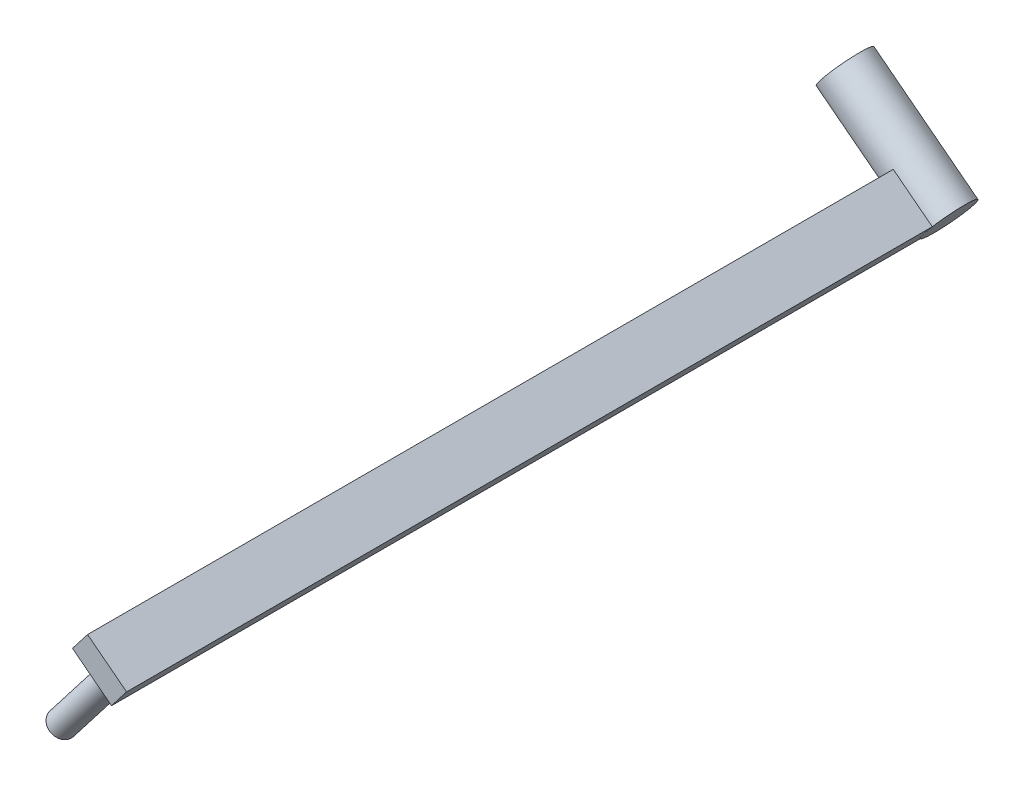
ISO-10303-21;
HEADER;
FILE_DESCRIPTION(('STEP AP214'),'2;1');
FILE_NAME('part.step','',(''),(''),'','','');
FILE_SCHEMA(('AUTOMOTIVE_DESIGN { 1 0 10303 214 1 1 1 1 }'));
ENDSEC;
DATA;
#1=APPLICATION_CONTEXT('core data for automotive mechanical design processes');
#2=APPLICATION_PROTOCOL_DEFINITION('international standard','automotive_design',2000,#1);
#3=PRODUCT_CONTEXT('',#1,'mechanical');
#4=PRODUCT('Part','Part','',(#3));
#5=PRODUCT_RELATED_PRODUCT_CATEGORY('part','',(#4));
#6=PRODUCT_DEFINITION_FORMATION('','',#4);
#7=PRODUCT_DEFINITION_CONTEXT('part definition',#1,'design');
#8=PRODUCT_DEFINITION('design','',#6,#7);
#9=PRODUCT_DEFINITION_SHAPE('','',#8);
#10=(LENGTH_UNIT() NAMED_UNIT(*) SI_UNIT(.MILLI.,.METRE.));
#11=(NAMED_UNIT(*) PLANE_ANGLE_UNIT() SI_UNIT($,.RADIAN.));
#12=(NAMED_UNIT(*) SI_UNIT($,.STERADIAN.) SOLID_ANGLE_UNIT());
#13=UNCERTAINTY_MEASURE_WITH_UNIT(LENGTH_MEASURE(1.E-05),#10,'distance_accuracy_value','');
#14=(GEOMETRIC_REPRESENTATION_CONTEXT(3) GLOBAL_UNCERTAINTY_ASSIGNED_CONTEXT((#13)) GLOBAL_UNIT_ASSIGNED_CONTEXT((#10,
#11,#12)) REPRESENTATION_CONTEXT('',''));
#15=CARTESIAN_POINT('',(0.,0.,0.));
#16=DIRECTION('',(0.,0.,1.));
#17=DIRECTION('',(1.,0.,0.));
#18=AXIS2_PLACEMENT_3D('',#15,#16,#17);
#19=CARTESIAN_POINT('',(-180.64816500639,168.184125113509,-1.22395092024198E-13));
#20=DIRECTION('',(-0.611527040185828,-0.791223532967492,0.));
#21=DIRECTION('',(0.791223532967493,-0.611527040185828,0.));
#22=AXIS2_PLACEMENT_3D('',#19,#20,#21);
#23=PLANE('',#22);
#24=DIRECTION('',(0.,0.,1.));
#25=VECTOR('',#24,1.);
#26=CARTESIAN_POINT('',(-183.021835605293,170.018706234067,-1.23368285722228E-13));
#27=LINE('',#26,#25);
#28=CARTESIAN_POINT('',(-183.021835605293,170.018706234067,-196.122895608607));
#29=VERTEX_POINT('',#28);
#30=CARTESIAN_POINT('',(-183.021835605293,170.018706234067,-147.122895608606));
#31=VERTEX_POINT('',#30);
#32=EDGE_CURVE('E120',#29,#31,#27,.T.);
#33=ORIENTED_EDGE('',*,*,#32,.T.);
#34=DIRECTION('',(-0.791223532967492,0.611527040185828,0.));
#35=VECTOR('',#34,1.);
#36=CARTESIAN_POINT('',(-180.64816500639,168.184125113509,-147.122895608606));
#37=LINE('',#36,#35);
#38=CARTESIAN_POINT('',(-180.64816500639,168.184125113509,-147.122895608606));
#39=VERTEX_POINT('',#38);
#40=EDGE_CURVE('E13',#39,#31,#37,.T.);
#41=ORIENTED_EDGE('',*,*,#40,.F.);
#42=DIRECTION('',(0.,0.,1.));
#43=VECTOR('',#42,1.);
#44=CARTESIAN_POINT('',(-180.64816500639,168.184125113509,-1.22395092024198E-13));
#45=LINE('',#44,#43);
#46=CARTESIAN_POINT('',(-180.64816500639,168.184125113509,-196.122895608607));
#47=VERTEX_POINT('',#46);
#48=EDGE_CURVE('E105',#47,#39,#45,.T.);
#49=ORIENTED_EDGE('',*,*,#48,.F.);
#50=DIRECTION('',(-0.791223532967492,0.611527040185828,0.));
#51=VECTOR('',#50,1.);
#52=CARTESIAN_POINT('',(-180.64816500639,168.184125113509,-196.122895608607));
#53=LINE('',#52,#51);
#54=EDGE_CURVE('E116',#47,#29,#53,.T.);
#55=ORIENTED_EDGE('',*,*,#54,.T.);
#56=EDGE_LOOP('',(#33,#41,#49,#55));
#57=FACE_BOUND('',#56,.T.);
#58=ADVANCED_FACE('F58',(#57),#23,.F.);
#59=CARTESIAN_POINT('',(-194.468676114589,150.302473268445,-147.122895608606));
#60=DIRECTION('',(0.,0.,-1.));
#61=DIRECTION('',(-1.,0.,0.));
#62=AXIS2_PLACEMENT_3D('',#59,#60,#61);
#63=PLANE('',#62);
#64=DIRECTION('',(-0.611527040185828,-0.791223532967493,0.));
#65=VECTOR('',#64,1.);
#66=CARTESIAN_POINT('',(-196.842346713492,152.137054389003,-147.122895608606));
#67=LINE('',#66,#65);
#68=CARTESIAN_POINT('',(-183.939126165572,168.831870934616,-147.122895608606));
#69=VERTEX_POINT('',#68);
#70=EDGE_CURVE('E110',#31,#69,#67,.T.);
#71=ORIENTED_EDGE('',*,*,#70,.T.);
#72=DIRECTION('',(-0.791223532967492,0.611527040185828,0.));
#73=VECTOR('',#72,1.);
#74=CARTESIAN_POINT('',(-181.565455566669,166.997289814058,-147.122895608606));
#75=LINE('',#74,#73);
#76=CARTESIAN_POINT('',(-181.565455566669,166.997289814058,-147.122895608606));
#77=VERTEX_POINT('',#76);
#78=EDGE_CURVE('E66',#77,#69,#75,.T.);
#79=ORIENTED_EDGE('',*,*,#78,.F.);
#80=DIRECTION('',(-0.611527040185828,-0.791223532967493,0.));
#81=VECTOR('',#80,1.);
#82=CARTESIAN_POINT('',(-194.468676114589,150.302473268445,-147.122895608606));
#83=LINE('',#82,#81);
#84=EDGE_CURVE('E100',#39,#77,#83,.T.);
#85=ORIENTED_EDGE('',*,*,#84,.F.);
#86=ORIENTED_EDGE('',*,*,#40,.T.);
#87=EDGE_LOOP('',(#71,#79,#85,#86));
#88=FACE_BOUND('',#87,.T.);
#89=ADVANCED_FACE('F109',(#88),#63,.F.);
#90=CARTESIAN_POINT('',(-181.565455566669,166.997289814058,-1.30223586740734E-13));
#91=DIRECTION('',(-0.611527040185828,-0.791223532967492,0.));
#92=DIRECTION('',(0.791223532967493,-0.611527040185828,0.));
#93=AXIS2_PLACEMENT_3D('',#90,#91,#92);
#94=PLANE('',#93);
#95=CARTESIAN_POINT('',(-182.390496862954,167.634954191982,-147.977498822314));
#96=DIRECTION('',(-0.611527040185828,-0.791223532967493,0.));
#97=DIRECTION('',(0.791223532967493,-0.611527040185828,0.));
#98=AXIS2_PLACEMENT_3D('',#95,#96,#97);
#99=CIRCLE('',#98,0.74999999998796);
#100=CARTESIAN_POINT('',(-181.797079213238,167.17630891185,-147.977498822314));
#101=VERTEX_POINT('',#100);
#102=EDGE_CURVE('E196',#101,#101,#99,.T.);
#103=ORIENTED_EDGE('',*,*,#102,.F.);
#104=EDGE_LOOP('',(#103));
#105=FACE_BOUND('',#104,.T.);
#106=DIRECTION('',(0.,0.,1.));
#107=VECTOR('',#106,1.);
#108=CARTESIAN_POINT('',(-183.939126165572,168.831870934616,-1.31196780438764E-13));
#109=LINE('',#108,#107);
#110=CARTESIAN_POINT('',(-183.939126165572,168.831870934616,-196.29704261835));
#111=VERTEX_POINT('',#110);
#112=EDGE_CURVE('E125',#111,#69,#109,.T.);
#113=ORIENTED_EDGE('',*,*,#112,.F.);
#114=DIRECTION('',(-0.791223532967492,0.611527040185828,0.));
#115=VECTOR('',#114,1.);
#116=CARTESIAN_POINT('',(-181.565455566669,166.997289814058,-196.29704261835));
#117=LINE('',#116,#115);
#118=CARTESIAN_POINT('',(-181.565455566669,166.997289814058,-196.29704261835));
#119=VERTEX_POINT('',#118);
#120=EDGE_CURVE('E90',#119,#111,#117,.T.);
#121=ORIENTED_EDGE('',*,*,#120,.F.);
#122=DIRECTION('',(0.,0.,1.));
#123=VECTOR('',#122,1.);
#124=CARTESIAN_POINT('',(-181.565455566669,166.997289814058,-1.30223586740734E-13));
#125=LINE('',#124,#123);
#126=EDGE_CURVE('E103',#119,#77,#125,.T.);
#127=ORIENTED_EDGE('',*,*,#126,.T.);
#128=ORIENTED_EDGE('',*,*,#78,.T.);
#129=EDGE_LOOP('',(#113,#121,#127,#128));
#130=FACE_BOUND('',#129,.T.);
#131=ADVANCED_FACE('F114',(#105,#130),#94,.T.);
#132=CARTESIAN_POINT('',(-181.014305085947,167.710395207437,-197.512913026703));
#133=DIRECTION('',(-0.791223532967492,0.611527040185828,0.));
#134=DIRECTION('',(-0.611527040185828,-0.791223532967493,0.));
#135=AXIS2_PLACEMENT_3D('',#132,#133,#134);
#136=CYLINDRICAL_SURFACE('',#135,1.51348174894076);
#137=CARTESIAN_POINT('',(-183.387975684849,169.544976327995,-197.512913026703));
#138=DIRECTION('',(0.791223532967492,-0.611527040185828,0.));
#139=DIRECTION('',(0.611527040185828,0.791223532967493,0.));
#140=AXIS2_PLACEMENT_3D('',#137,#138,#139);
#141=CIRCLE('',#140,1.51348174894076);
#142=EDGE_CURVE('E93',#111,#29,#141,.F.);
#143=ORIENTED_EDGE('',*,*,#142,.T.);
#144=ORIENTED_EDGE('',*,*,#54,.F.);
#145=CARTESIAN_POINT('',(-181.014305085947,167.710395207437,-197.512913026703));
#146=DIRECTION('',(0.791223532967492,-0.611527040185828,0.));
#147=DIRECTION('',(0.611527040185828,0.791223532967493,0.));
#148=AXIS2_PLACEMENT_3D('',#145,#146,#147);
#149=CIRCLE('',#148,1.51348174894076);
#150=EDGE_CURVE('E74',#119,#47,#149,.F.);
#151=ORIENTED_EDGE('',*,*,#150,.F.);
#152=ORIENTED_EDGE('',*,*,#120,.T.);
#153=EDGE_LOOP('',(#143,#144,#151,#152));
#154=FACE_BOUND('',#153,.T.);
#155=ADVANCED_FACE('F143',(#154),#136,.F.);
#156=CARTESIAN_POINT('',(-194.468676114589,150.302473268445,-1.30223586740734E-13));
#157=DIRECTION('',(0.791223532967492,-0.611527040185828,0.));
#158=DIRECTION('',(0.611527040185828,0.791223532967493,0.));
#159=AXIS2_PLACEMENT_3D('',#156,#157,#158);
#160=PLANE('',#159);
#161=ORIENTED_EDGE('',*,*,#48,.T.);
#162=ORIENTED_EDGE('',*,*,#84,.T.);
#163=ORIENTED_EDGE('',*,*,#126,.F.);
#164=ORIENTED_EDGE('',*,*,#150,.T.);
#165=EDGE_LOOP('',(#161,#162,#163,#164));
#166=FACE_BOUND('',#165,.T.);
#167=ADVANCED_FACE('F101',(#166),#160,.T.);
#168=CARTESIAN_POINT('',(-196.842346713492,152.137054389003,-1.31196780438764E-13));
#169=DIRECTION('',(0.791223532967492,-0.611527040185828,0.));
#170=DIRECTION('',(0.611527040185828,0.791223532967493,0.));
#171=AXIS2_PLACEMENT_3D('',#168,#169,#170);
#172=PLANE('',#171);
#173=ORIENTED_EDGE('',*,*,#32,.F.);
#174=ORIENTED_EDGE('',*,*,#142,.F.);
#175=ORIENTED_EDGE('',*,*,#112,.T.);
#176=ORIENTED_EDGE('',*,*,#70,.F.);
#177=EDGE_LOOP('',(#173,#174,#175,#176));
#178=FACE_BOUND('',#177,.T.);
#179=ADVANCED_FACE('F132',(#178),#172,.F.);
#180=CARTESIAN_POINT('',(-185.448132063884,163.678836527145,-147.977498822314));
#181=DIRECTION('',(0.611527040185828,0.791223532967493,0.));
#182=DIRECTION('',(-0.791223532967493,0.611527040185828,0.));
#183=AXIS2_PLACEMENT_3D('',#180,#181,#182);
#184=CYLINDRICAL_SURFACE('',#183,0.74999999998796);
#185=CARTESIAN_POINT('',(-185.448132063884,163.678836527145,-147.977498822314));
#186=DIRECTION('',(-0.611527040185828,-0.791223532967493,0.));
#187=DIRECTION('',(0.791223532967493,-0.611527040185828,0.));
#188=AXIS2_PLACEMENT_3D('',#185,#186,#187);
#189=CIRCLE('',#188,0.74999999998796);
#190=CARTESIAN_POINT('',(-184.854714414167,163.220191247013,-147.977498822314));
#191=VERTEX_POINT('',#190);
#192=EDGE_CURVE('E123',#191,#191,#189,.T.);
#193=ORIENTED_EDGE('',*,*,#192,.F.);
#194=EDGE_LOOP('',(#193));
#195=FACE_BOUND('',#194,.T.);
#196=ORIENTED_EDGE('',*,*,#102,.T.);
#197=EDGE_LOOP('',(#196));
#198=FACE_BOUND('',#197,.T.);
#199=ADVANCED_FACE('F134',(#195,#198),#184,.T.);
#200=CARTESIAN_POINT('',(-185.448132063884,163.678836527145,-147.977498822314));
#201=DIRECTION('',(-0.611527040185828,-0.791223532967493,0.));
#202=DIRECTION('',(0.791223532967493,-0.611527040185828,0.));
#203=AXIS2_PLACEMENT_3D('',#200,#201,#202);
#204=PLANE('',#203);
#205=ORIENTED_EDGE('',*,*,#192,.T.);
#206=EDGE_LOOP('',(#205));
#207=FACE_BOUND('',#206,.T.);
#208=ADVANCED_FACE('F140',(#207),#204,.T.);
#209=CLOSED_SHELL('',(#58,#89,#131,#155,#167,#179,#199,#208));
#210=MANIFOLD_SOLID_BREP('B2',#209);
#211=CARTESIAN_POINT('',(-187.344093349687,172.602611528924,-197.512913026703));
#212=DIRECTION('',(0.791223532967493,-0.611527040185828,0.));
#213=DIRECTION('',(0.611527040185828,0.791223532967493,0.));
#214=AXIS2_PLACEMENT_3D('',#211,#212,#213);
#215=CYLINDRICAL_SURFACE('',#214,1.5);
#216=CARTESIAN_POINT('',(-187.344093349687,172.602611528924,-197.512913026703));
#217=DIRECTION('',(0.791223532967492,-0.611527040185828,0.));
#218=DIRECTION('',(0.611527040185828,0.791223532967493,0.));
#219=AXIS2_PLACEMENT_3D('',#216,#217,#218);
#220=CIRCLE('',#219,1.5);
#221=CARTESIAN_POINT('',(-186.426802789408,173.789446828375,-197.512913026703));
#222=VERTEX_POINT('',#221);
#223=EDGE_CURVE('E57',#222,#222,#220,.T.);
#224=CARTESIAN_POINT('',(-181.014305085947,167.710395207437,-197.512913026703));
#225=DIRECTION('',(0.791223532967492,-0.611527040185828,0.));
#226=DIRECTION('',(0.611527040185828,0.791223532967493,0.));
#227=AXIS2_PLACEMENT_3D('',#224,#225,#226);
#228=CIRCLE('',#227,1.5);
#229=CARTESIAN_POINT('',(-180.097014525668,168.897230506889,-197.512913026703));
#230=VERTEX_POINT('',#229);
#231=EDGE_CURVE('E224',#230,#230,#228,.T.);
#232=CARTESIAN_POINT('',(-186.426802789408,173.789446828375,-197.512913026703));
#233=CARTESIAN_POINT('',(-186.360867494994,173.738486241693,-197.512913026703));
#234=CARTESIAN_POINT('',(-186.29493220058,173.687525655011,-197.512913026703));
#235=CARTESIAN_POINT('',(-186.163061611752,173.585604481647,-197.512913026703));
#236=CARTESIAN_POINT('',(-186.097126317338,173.534643894964,-197.512913026703));
#237=CARTESIAN_POINT('',(-185.96525572851,173.4327227216,-197.512913026703));
#238=CARTESIAN_POINT('',(-185.899320434096,173.381762134918,-197.512913026703));
#239=CARTESIAN_POINT('',(-185.767449845269,173.279840961554,-197.512913026703));
#240=CARTESIAN_POINT('',(-185.701514550855,173.228880374871,-197.512913026703));
#241=CARTESIAN_POINT('',(-185.569643962027,173.126959201507,-197.512913026703));
#242=CARTESIAN_POINT('',(-185.503708667613,173.075998614825,-197.512913026703));
#243=CARTESIAN_POINT('',(-185.371838078785,172.974077441461,-197.512913026703));
#244=CARTESIAN_POINT('',(-185.305902784371,172.923116854779,-197.512913026703));
#245=CARTESIAN_POINT('',(-185.174032195543,172.821195681414,-197.512913026703));
#246=CARTESIAN_POINT('',(-185.108096901129,172.770235094732,-197.512913026703));
#247=CARTESIAN_POINT('',(-184.976226312301,172.668313921368,-197.512913026703));
#248=CARTESIAN_POINT('',(-184.910291017887,172.617353334686,-197.512913026703));
#249=CARTESIAN_POINT('',(-184.778420429059,172.515432161321,-197.512913026703));
#250=CARTESIAN_POINT('',(-184.712485134645,172.464471574639,-197.512913026703));
#251=CARTESIAN_POINT('',(-184.580614545817,172.362550401275,-197.512913026703));
#252=CARTESIAN_POINT('',(-184.514679251403,172.311589814593,-197.512913026703));
#253=CARTESIAN_POINT('',(-184.382808662575,172.209668641228,-197.512913026703));
#254=CARTESIAN_POINT('',(-184.316873368161,172.158708054546,-197.512913026703));
#255=CARTESIAN_POINT('',(-184.185002779334,172.056786881182,-197.512913026703));
#256=CARTESIAN_POINT('',(-184.11906748492,172.0058262945,-197.512913026703));
#257=CARTESIAN_POINT('',(-183.987196896092,171.903905121136,-197.512913026703));
#258=CARTESIAN_POINT('',(-183.921261601678,171.852944534453,-197.512913026703));
#259=CARTESIAN_POINT('',(-183.78939101285,171.751023361089,-197.512913026703));
#260=CARTESIAN_POINT('',(-183.723455718436,171.700062774407,-197.512913026703));
#261=CARTESIAN_POINT('',(-183.591585129608,171.598141601043,-197.512913026703));
#262=CARTESIAN_POINT('',(-183.525649835194,171.54718101436,-197.512913026703));
#263=CARTESIAN_POINT('',(-183.393779246366,171.445259840996,-197.512913026703));
#264=CARTESIAN_POINT('',(-183.327843951952,171.394299254314,-197.512913026703));
#265=CARTESIAN_POINT('',(-183.195973363124,171.29237808095,-197.512913026703));
#266=CARTESIAN_POINT('',(-183.13003806871,171.241417494268,-197.512913026703));
#267=CARTESIAN_POINT('',(-182.998167479882,171.139496320903,-197.512913026703));
#268=CARTESIAN_POINT('',(-182.932232185468,171.088535734221,-197.512913026703));
#269=CARTESIAN_POINT('',(-182.80036159664,170.986614560857,-197.512913026703));
#270=CARTESIAN_POINT('',(-182.734426302226,170.935653974175,-197.512913026703));
#271=CARTESIAN_POINT('',(-182.602555713399,170.83373280081,-197.512913026703));
#272=CARTESIAN_POINT('',(-182.536620418985,170.782772214128,-197.512913026703));
#273=CARTESIAN_POINT('',(-182.404749830157,170.680851040764,-197.512913026703));
#274=CARTESIAN_POINT('',(-182.338814535743,170.629890454082,-197.512913026703));
#275=CARTESIAN_POINT('',(-182.206943946915,170.527969280717,-197.512913026703));
#276=CARTESIAN_POINT('',(-182.141008652501,170.477008694035,-197.512913026703));
#277=CARTESIAN_POINT('',(-182.009138063673,170.375087520671,-197.512913026703));
#278=CARTESIAN_POINT('',(-181.943202769259,170.324126933989,-197.512913026703));
#279=CARTESIAN_POINT('',(-181.811332180431,170.222205760625,-197.512913026703));
#280=CARTESIAN_POINT('',(-181.745396886017,170.171245173942,-197.512913026703));
#281=CARTESIAN_POINT('',(-181.613526297189,170.069324000578,-197.512913026703));
#282=CARTESIAN_POINT('',(-181.547591002775,170.018363413896,-197.512913026703));
#283=CARTESIAN_POINT('',(-181.415720413947,169.916442240532,-197.512913026703));
#284=CARTESIAN_POINT('',(-181.349785119533,169.865481653849,-197.512913026703));
#285=CARTESIAN_POINT('',(-181.217914530705,169.763560480485,-197.512913026703));
#286=CARTESIAN_POINT('',(-181.151979236292,169.712599893803,-197.512913026703));
#287=CARTESIAN_POINT('',(-181.020108647464,169.610678720439,-197.512913026703));
#288=CARTESIAN_POINT('',(-180.95417335305,169.559718133757,-197.512913026703));
#289=CARTESIAN_POINT('',(-180.822302764222,169.457796960392,-197.512913026703));
#290=CARTESIAN_POINT('',(-180.756367469808,169.40683637371,-197.512913026703));
#291=CARTESIAN_POINT('',(-180.62449688098,169.304915200346,-197.512913026703));
#292=CARTESIAN_POINT('',(-180.558561586566,169.253954613664,-197.512913026703));
#293=CARTESIAN_POINT('',(-180.426690997738,169.152033440299,-197.512913026703));
#294=CARTESIAN_POINT('',(-180.360755703324,169.101072853617,-197.512913026703));
#295=CARTESIAN_POINT('',(-180.228885114496,168.999151680253,-197.512913026703));
#296=CARTESIAN_POINT('',(-180.162949820082,168.948191093571,-197.512913026703));
#297=CARTESIAN_POINT('',(-180.097014525668,168.897230506889,-197.512913026703));
#298=B_SPLINE_CURVE_WITH_KNOTS('',3,(#232,#233,#234,#235,#236,#237,#238,#239,#240,#241,#242,
#243,#244,#245,#246,#247,#248,#249,#250,#251,#252,#253,#254,#255,#256,#257,#258,#259,#260,#261,
#262,#263,#264,#265,#266,#267,#268,#269,#270,#271,#272,#273,#274,#275,#276,#277,#278,#279,#280,
#281,#282,#283,#284,#285,#286,#287,#288,#289,#290,#291,#292,#293,#294,#295,#296,#297),
.UNSPECIFIED.,.F.,.F.,(4,2,2,2,2,2,2,2,2,2,2,2,2,2,2,2,2,2,2,2,2,2,2,2,2,2,2,2,2,2,2,2,4),(0.,
0.249999999999997,0.499999999999994,0.750000000000013,0.999999999999992,1.24999999999999,
1.50000000000001,1.75000000000001,1.99999999999998,2.25,2.5,2.75,3.,3.25,3.49999999999999,
3.74999999999999,3.99999999999999,4.24999999999999,4.50000000000001,4.75,4.99999999999998,5.25,
5.5,5.75,6.,6.24999999999999,6.49999999999999,6.74999999999999,6.99999999999999,
7.24999999999999,7.50000000000001,7.75,7.99999999999998),.UNSPECIFIED.);
#299=EDGE_CURVE('BSEAM218',#222,#230,#298,.T.);
#300=ORIENTED_EDGE('',*,*,#223,.T.);
#301=ORIENTED_EDGE('',*,*,#231,.F.);
#302=ORIENTED_EDGE('',*,*,#299,.T.);
#303=ORIENTED_EDGE('',*,*,#299,.F.);
#304=EDGE_LOOP('',(#300,#302,#301,#303));
#305=FACE_BOUND('',#304,.T.);
#306=ADVANCED_FACE('F218',(#305),#215,.T.);
#307=CARTESIAN_POINT('',(-200.798464378329,155.194689589932,-1.32818769935481E-13));
#308=DIRECTION('',(0.791223532967492,-0.611527040185828,0.));
#309=DIRECTION('',(0.611527040185828,0.791223532967493,0.));
#310=AXIS2_PLACEMENT_3D('',#307,#308,#309);
#311=PLANE('',#310);
#312=ORIENTED_EDGE('',*,*,#223,.F.);
#313=EDGE_LOOP('',(#312));
#314=FACE_BOUND('',#313,.T.);
#315=ADVANCED_FACE('F233',(#314),#311,.F.);
#316=CARTESIAN_POINT('',(-194.468676114589,150.302473268445,-1.30223586740734E-13));
#317=DIRECTION('',(0.791223532967492,-0.611527040185828,0.));
#318=DIRECTION('',(0.611527040185828,0.791223532967493,0.));
#319=AXIS2_PLACEMENT_3D('',#316,#317,#318);
#320=PLANE('',#319);
#321=ORIENTED_EDGE('',*,*,#231,.T.);
#322=EDGE_LOOP('',(#321));
#323=FACE_BOUND('',#322,.T.);
#324=ADVANCED_FACE('F230',(#323),#320,.T.);
#325=CLOSED_SHELL('',(#306,#315,#324));
#326=MANIFOLD_SOLID_BREP('B7',#325);
#327=ADVANCED_BREP_SHAPE_REPRESENTATION('',(#18,#210,#326),#14);
#328=SHAPE_DEFINITION_REPRESENTATION(#9,#327);
ENDSEC;
END-ISO-10303-21;
